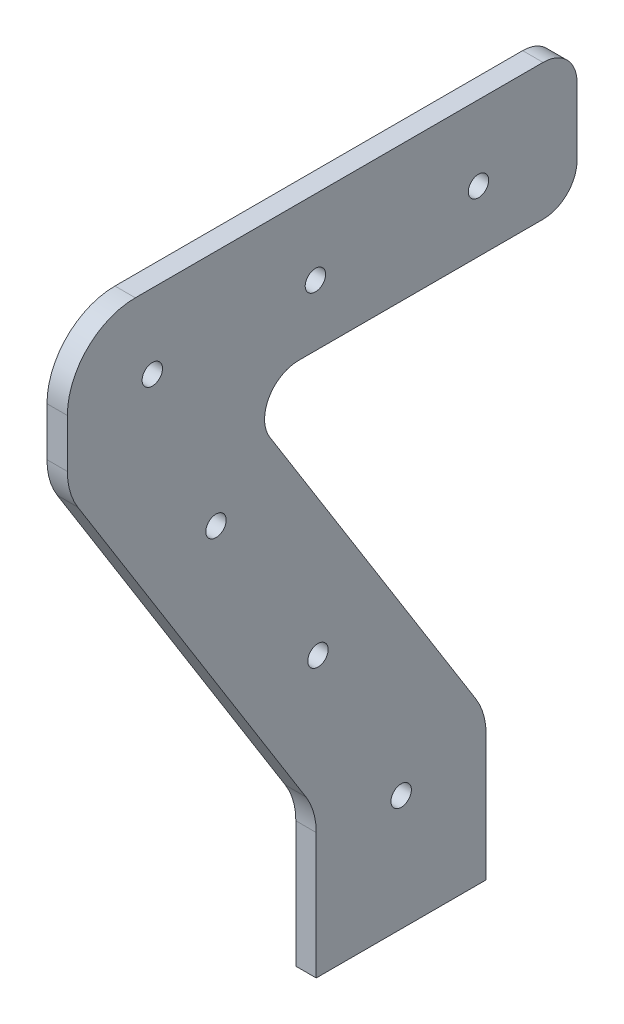
ISO-10303-21;
HEADER;
FILE_DESCRIPTION(('STEP AP214'),'2;1');
FILE_NAME('part.step','',(''),(''),'','','');
FILE_SCHEMA(('AUTOMOTIVE_DESIGN { 1 0 10303 214 1 1 1 1 }'));
ENDSEC;
DATA;
#1=APPLICATION_CONTEXT('core data for automotive mechanical design processes');
#2=APPLICATION_PROTOCOL_DEFINITION('international standard','automotive_design',2000,#1);
#3=PRODUCT_CONTEXT('',#1,'mechanical');
#4=PRODUCT('Part','Part','',(#3));
#5=PRODUCT_RELATED_PRODUCT_CATEGORY('part','',(#4));
#6=PRODUCT_DEFINITION_FORMATION('','',#4);
#7=PRODUCT_DEFINITION_CONTEXT('part definition',#1,'design');
#8=PRODUCT_DEFINITION('design','',#6,#7);
#9=PRODUCT_DEFINITION_SHAPE('','',#8);
#10=(LENGTH_UNIT() NAMED_UNIT(*) SI_UNIT(.MILLI.,.METRE.));
#11=(NAMED_UNIT(*) PLANE_ANGLE_UNIT() SI_UNIT($,.RADIAN.));
#12=(NAMED_UNIT(*) SI_UNIT($,.STERADIAN.) SOLID_ANGLE_UNIT());
#13=UNCERTAINTY_MEASURE_WITH_UNIT(LENGTH_MEASURE(1.E-05),#10,'distance_accuracy_value','');
#14=(GEOMETRIC_REPRESENTATION_CONTEXT(3) GLOBAL_UNCERTAINTY_ASSIGNED_CONTEXT((#13)) GLOBAL_UNIT_ASSIGNED_CONTEXT((#10,
#11,#12)) REPRESENTATION_CONTEXT('',''));
#15=CARTESIAN_POINT('',(0.,0.,0.));
#16=DIRECTION('',(0.,0.,1.));
#17=DIRECTION('',(1.,0.,0.));
#18=AXIS2_PLACEMENT_3D('',#15,#16,#17);
#19=CARTESIAN_POINT('',(3.,0.,0.));
#20=DIRECTION('',(0.,0.,-1.));
#21=DIRECTION('',(-1.,0.,0.));
#22=AXIS2_PLACEMENT_3D('',#19,#20,#21);
#23=PLANE('',#22);
#24=DIRECTION('',(0.,-1.,0.));
#25=VECTOR('',#24,1.);
#26=CARTESIAN_POINT('',(0.,0.,0.));
#27=LINE('',#26,#25);
#28=CARTESIAN_POINT('',(0.,-10.,0.));
#29=VERTEX_POINT('',#28);
#30=CARTESIAN_POINT('',(0.,-17.1320377358859,0.));
#31=VERTEX_POINT('',#30);
#32=EDGE_CURVE('E221',#29,#31,#27,.T.);
#33=ORIENTED_EDGE('',*,*,#32,.T.);
#34=DIRECTION('',(1.,0.,0.));
#35=VECTOR('',#34,1.);
#36=CARTESIAN_POINT('',(3.,-17.1320377358859,0.));
#37=LINE('',#36,#35);
#38=CARTESIAN_POINT('',(3.,-17.1320377358859,0.));
#39=VERTEX_POINT('',#38);
#40=EDGE_CURVE('E260',#31,#39,#37,.T.);
#41=ORIENTED_EDGE('',*,*,#40,.T.);
#42=DIRECTION('',(0.,-1.,0.));
#43=VECTOR('',#42,1.);
#44=CARTESIAN_POINT('',(3.,0.,0.));
#45=LINE('',#44,#43);
#46=CARTESIAN_POINT('',(3.,-10.,0.));
#47=VERTEX_POINT('',#46);
#48=EDGE_CURVE('E230',#47,#39,#45,.T.);
#49=ORIENTED_EDGE('',*,*,#48,.F.);
#50=DIRECTION('',(-1.,0.,0.));
#51=VECTOR('',#50,1.);
#52=CARTESIAN_POINT('',(3.,-10.,0.));
#53=LINE('',#52,#51);
#54=EDGE_CURVE('E257',#47,#29,#53,.T.);
#55=ORIENTED_EDGE('',*,*,#54,.T.);
#56=EDGE_LOOP('',(#33,#41,#49,#55));
#57=FACE_BOUND('',#56,.T.);
#58=ADVANCED_FACE('F77',(#57),#23,.F.);
#59=CARTESIAN_POINT('',(3.,-100.,0.));
#60=DIRECTION('',(0.,1.,0.));
#61=DIRECTION('',(0.,0.,1.));
#62=AXIS2_PLACEMENT_3D('',#59,#60,#61);
#63=PLANE('',#62);
#64=DIRECTION('',(1.,0.,0.));
#65=VECTOR('',#64,1.);
#66=CARTESIAN_POINT('',(0.,-100.,-61.6219787528252));
#67=LINE('',#66,#65);
#68=CARTESIAN_POINT('',(0.,-100.,-61.6219787528252));
#69=VERTEX_POINT('',#68);
#70=CARTESIAN_POINT('',(3.,-100.,-61.6219787528252));
#71=VERTEX_POINT('',#70);
#72=EDGE_CURVE('E190',#69,#71,#67,.T.);
#73=ORIENTED_EDGE('',*,*,#72,.T.);
#74=DIRECTION('',(0.,0.,-1.));
#75=VECTOR('',#74,1.);
#76=CARTESIAN_POINT('',(3.,-100.,0.));
#77=LINE('',#76,#75);
#78=CARTESIAN_POINT('',(3.,-100.,-36.6219787528252));
#79=VERTEX_POINT('',#78);
#80=EDGE_CURVE('E327',#79,#71,#77,.T.);
#81=ORIENTED_EDGE('',*,*,#80,.F.);
#82=DIRECTION('',(1.,0.,0.));
#83=VECTOR('',#82,1.);
#84=CARTESIAN_POINT('',(0.,-100.,-36.6219787528252));
#85=LINE('',#84,#83);
#86=CARTESIAN_POINT('',(0.,-100.,-36.6219787528252));
#87=VERTEX_POINT('',#86);
#88=EDGE_CURVE('E219',#87,#79,#85,.T.);
#89=ORIENTED_EDGE('',*,*,#88,.F.);
#90=DIRECTION('',(0.,0.,-1.));
#91=VECTOR('',#90,1.);
#92=CARTESIAN_POINT('',(0.,-100.,0.));
#93=LINE('',#92,#91);
#94=EDGE_CURVE('E210',#87,#69,#93,.T.);
#95=ORIENTED_EDGE('',*,*,#94,.T.);
#96=EDGE_LOOP('',(#73,#81,#89,#95));
#97=FACE_BOUND('',#96,.T.);
#98=ADVANCED_FACE('F217',(#97),#63,.F.);
#99=CARTESIAN_POINT('',(3.,0.,-75.));
#100=DIRECTION('',(0.,0.,1.));
#101=DIRECTION('',(0.,-1.,0.));
#102=AXIS2_PLACEMENT_3D('',#99,#100,#101);
#103=PLANE('',#102);
#104=DIRECTION('',(0.,1.,0.));
#105=VECTOR('',#104,1.);
#106=CARTESIAN_POINT('',(0.,0.,-75.));
#107=LINE('',#106,#105);
#108=CARTESIAN_POINT('',(0.,-15.,-75.));
#109=VERTEX_POINT('',#108);
#110=CARTESIAN_POINT('',(0.,-5.,-75.));
#111=VERTEX_POINT('',#110);
#112=EDGE_CURVE('E220',#109,#111,#107,.T.);
#113=ORIENTED_EDGE('',*,*,#112,.T.);
#114=DIRECTION('',(-1.,0.,0.));
#115=VECTOR('',#114,1.);
#116=CARTESIAN_POINT('',(3.,-5.,-75.));
#117=LINE('',#116,#115);
#118=CARTESIAN_POINT('',(3.,-5.,-75.));
#119=VERTEX_POINT('',#118);
#120=EDGE_CURVE('E92',#111,#119,#117,.F.);
#121=ORIENTED_EDGE('',*,*,#120,.T.);
#122=DIRECTION('',(0.,1.,0.));
#123=VECTOR('',#122,1.);
#124=CARTESIAN_POINT('',(3.,0.,-75.));
#125=LINE('',#124,#123);
#126=CARTESIAN_POINT('',(3.,-15.,-75.));
#127=VERTEX_POINT('',#126);
#128=EDGE_CURVE('E329',#127,#119,#125,.T.);
#129=ORIENTED_EDGE('',*,*,#128,.F.);
#130=DIRECTION('',(1.,0.,0.));
#131=VECTOR('',#130,1.);
#132=CARTESIAN_POINT('',(0.,-15.,-75.));
#133=LINE('',#132,#131);
#134=EDGE_CURVE('E285',#127,#109,#133,.F.);
#135=ORIENTED_EDGE('',*,*,#134,.T.);
#136=EDGE_LOOP('',(#113,#121,#129,#135));
#137=FACE_BOUND('',#136,.T.);
#138=ADVANCED_FACE('F375',(#137),#103,.F.);
#139=CARTESIAN_POINT('',(3.,0.,0.));
#140=DIRECTION('',(1.,0.,0.));
#141=DIRECTION('',(0.,0.,-1.));
#142=AXIS2_PLACEMENT_3D('',#139,#140,#141);
#143=PLANE('',#142);
#144=CARTESIAN_POINT('',(3.,-35.,-21.875));
#145=DIRECTION('',(1.,0.,0.));
#146=DIRECTION('',(0.,0.,-1.));
#147=AXIS2_PLACEMENT_3D('',#144,#145,#146);
#148=CIRCLE('',#147,1.5);
#149=CARTESIAN_POINT('',(3.,-35.,-23.375));
#150=VERTEX_POINT('',#149);
#151=EDGE_CURVE('E431',#150,#150,#148,.T.);
#152=ORIENTED_EDGE('',*,*,#151,.F.);
#153=EDGE_LOOP('',(#152));
#154=FACE_BOUND('',#153,.T.);
#155=CARTESIAN_POINT('',(3.,-11.,-36.5));
#156=DIRECTION('',(1.,0.,0.));
#157=DIRECTION('',(0.,0.,-1.));
#158=AXIS2_PLACEMENT_3D('',#155,#156,#157);
#159=CIRCLE('',#158,1.5);
#160=CARTESIAN_POINT('',(3.,-11.,-38.));
#161=VERTEX_POINT('',#160);
#162=EDGE_CURVE('E443',#161,#161,#159,.T.);
#163=ORIENTED_EDGE('',*,*,#162,.F.);
#164=EDGE_LOOP('',(#163));
#165=FACE_BOUND('',#164,.T.);
#166=CARTESIAN_POINT('',(3.,-11.,-60.5));
#167=DIRECTION('',(1.,0.,0.));
#168=DIRECTION('',(0.,0.,-1.));
#169=AXIS2_PLACEMENT_3D('',#166,#167,#168);
#170=CIRCLE('',#169,1.5);
#171=CARTESIAN_POINT('',(3.,-11.,-62.));
#172=VERTEX_POINT('',#171);
#173=EDGE_CURVE('E442',#172,#172,#170,.T.);
#174=ORIENTED_EDGE('',*,*,#173,.F.);
#175=EDGE_LOOP('',(#174));
#176=FACE_BOUND('',#175,.T.);
#177=CARTESIAN_POINT('',(3.,-59.,-36.875));
#178=DIRECTION('',(1.,0.,0.));
#179=DIRECTION('',(0.,0.,-1.));
#180=AXIS2_PLACEMENT_3D('',#177,#178,#179);
#181=CIRCLE('',#180,1.5);
#182=CARTESIAN_POINT('',(3.,-59.,-38.375));
#183=VERTEX_POINT('',#182);
#184=EDGE_CURVE('E427',#183,#183,#181,.T.);
#185=ORIENTED_EDGE('',*,*,#184,.F.);
#186=EDGE_LOOP('',(#185));
#187=FACE_BOUND('',#186,.T.);
#188=CARTESIAN_POINT('',(3.,-83.,-49.1219787528252));
#189=DIRECTION('',(1.,0.,0.));
#190=DIRECTION('',(0.,0.,-1.));
#191=AXIS2_PLACEMENT_3D('',#188,#189,#190);
#192=CIRCLE('',#191,1.5);
#193=CARTESIAN_POINT('',(3.,-83.,-50.6219787528252));
#194=VERTEX_POINT('',#193);
#195=EDGE_CURVE('E434',#194,#194,#192,.T.);
#196=ORIENTED_EDGE('',*,*,#195,.F.);
#197=EDGE_LOOP('',(#196));
#198=FACE_BOUND('',#197,.T.);
#199=CARTESIAN_POINT('',(3.,-11.,-12.5));
#200=DIRECTION('',(1.,0.,0.));
#201=DIRECTION('',(0.,0.,-1.));
#202=AXIS2_PLACEMENT_3D('',#199,#200,#201);
#203=CIRCLE('',#202,1.5);
#204=CARTESIAN_POINT('',(3.,-11.,-14.));
#205=VERTEX_POINT('',#204);
#206=EDGE_CURVE('E454',#205,#205,#203,.T.);
#207=ORIENTED_EDGE('',*,*,#206,.F.);
#208=EDGE_LOOP('',(#207));
#209=FACE_BOUND('',#208,.T.);
#210=ORIENTED_EDGE('',*,*,#128,.T.);
#211=CARTESIAN_POINT('',(3.,-5.,-70.));
#212=DIRECTION('',(1.,0.,0.));
#213=DIRECTION('',(0.,0.,-1.));
#214=AXIS2_PLACEMENT_3D('',#211,#212,#213);
#215=CIRCLE('',#214,5.);
#216=CARTESIAN_POINT('',(3.,0.,-70.));
#217=VERTEX_POINT('',#216);
#218=EDGE_CURVE('E289',#119,#217,#215,.T.);
#219=ORIENTED_EDGE('',*,*,#218,.T.);
#220=DIRECTION('',(0.,0.,1.));
#221=VECTOR('',#220,1.);
#222=CARTESIAN_POINT('',(3.,0.,0.));
#223=LINE('',#222,#221);
#224=CARTESIAN_POINT('',(3.,0.,-10.));
#225=VERTEX_POINT('',#224);
#226=EDGE_CURVE('E234',#217,#225,#223,.T.);
#227=ORIENTED_EDGE('',*,*,#226,.T.);
#228=CARTESIAN_POINT('',(3.,-10.,-10.));
#229=DIRECTION('',(1.,0.,0.));
#230=DIRECTION('',(0.,0.,-1.));
#231=AXIS2_PLACEMENT_3D('',#228,#229,#230);
#232=CIRCLE('',#231,10.);
#233=EDGE_CURVE('E233',#225,#47,#232,.T.);
#234=ORIENTED_EDGE('',*,*,#233,.T.);
#235=ORIENTED_EDGE('',*,*,#48,.T.);
#236=CARTESIAN_POINT('',(3.,-17.1320377358859,-10.));
#237=DIRECTION('',(1.,0.,0.));
#238=DIRECTION('',(0.,0.,-1.));
#239=AXIS2_PLACEMENT_3D('',#236,#237,#238);
#240=CIRCLE('',#239,10.);
#241=CARTESIAN_POINT('',(3.,-22.4320271359176,-1.52001695994908));
#242=VERTEX_POINT('',#241);
#243=EDGE_CURVE('E236',#39,#242,#240,.T.);
#244=ORIENTED_EDGE('',*,*,#243,.T.);
#245=DIRECTION('',(0.,-0.847998304005092,-0.529998940003174));
#246=VECTOR('',#245,1.);
#247=CARTESIAN_POINT('',(3.,-5.61797752808948,8.98876404494332));
#248=LINE('',#247,#246);
#249=CARTESIAN_POINT('',(3.,-76.1631388686017,-35.1019617928761));
#250=VERTEX_POINT('',#249);
#251=EDGE_CURVE('E202',#242,#250,#248,.T.);
#252=ORIENTED_EDGE('',*,*,#251,.T.);
#253=CARTESIAN_POINT('',(3.,-81.4631282686334,-26.6219787528251));
#254=DIRECTION('',(1.,0.,0.));
#255=DIRECTION('',(0.,0.,-1.));
#256=AXIS2_PLACEMENT_3D('',#253,#254,#255);
#257=CIRCLE('',#256,10.);
#258=CARTESIAN_POINT('',(3.,-81.4631282686334,-36.6219787528252));
#259=VERTEX_POINT('',#258);
#260=EDGE_CURVE('E266',#250,#259,#257,.F.);
#261=ORIENTED_EDGE('',*,*,#260,.T.);
#262=DIRECTION('',(0.,-1.,0.));
#263=VECTOR('',#262,1.);
#264=CARTESIAN_POINT('',(3.,0.,-36.6219787528252));
#265=LINE('',#264,#263);
#266=EDGE_CURVE('E319',#259,#79,#265,.T.);
#267=ORIENTED_EDGE('',*,*,#266,.T.);
#268=ORIENTED_EDGE('',*,*,#80,.T.);
#269=DIRECTION('',(0.,1.,0.));
#270=VECTOR('',#269,1.);
#271=CARTESIAN_POINT('',(3.,0.,-61.6219787528252));
#272=LINE('',#271,#270);
#273=CARTESIAN_POINT('',(3.,-81.4631282686334,-61.6219787528252));
#274=VERTEX_POINT('',#273);
#275=EDGE_CURVE('E197',#71,#274,#272,.T.);
#276=ORIENTED_EDGE('',*,*,#275,.T.);
#277=CARTESIAN_POINT('',(3.,-81.4631282686334,-51.6219787528252));
#278=DIRECTION('',(1.,0.,0.));
#279=DIRECTION('',(0.,0.,-1.));
#280=AXIS2_PLACEMENT_3D('',#277,#278,#279);
#281=CIRCLE('',#280,10.);
#282=CARTESIAN_POINT('',(3.,-76.1631388686016,-60.101961792876));
#283=VERTEX_POINT('',#282);
#284=EDGE_CURVE('E238',#274,#283,#281,.T.);
#285=ORIENTED_EDGE('',*,*,#284,.T.);
#286=DIRECTION('',(0.,-0.847998304005088,-0.52999894000318));
#287=VECTOR('',#286,1.);
#288=CARTESIAN_POINT('',(3.,5.61797752808988,-8.98876404494381));
#289=LINE('',#288,#287);
#290=CARTESIAN_POINT('',(3.,-27.6499947000159,-29.7812466875099));
#291=VERTEX_POINT('',#290);
#292=EDGE_CURVE('E214',#291,#283,#289,.T.);
#293=ORIENTED_EDGE('',*,*,#292,.F.);
#294=CARTESIAN_POINT('',(3.,-25.,-34.0212382075354));
#295=DIRECTION('',(1.,0.,0.));
#296=DIRECTION('',(0.,0.,-1.));
#297=AXIS2_PLACEMENT_3D('',#294,#295,#296);
#298=CIRCLE('',#297,5.);
#299=CARTESIAN_POINT('',(3.,-20.,-34.0212382075354));
#300=VERTEX_POINT('',#299);
#301=EDGE_CURVE('E85',#291,#300,#298,.F.);
#302=ORIENTED_EDGE('',*,*,#301,.T.);
#303=DIRECTION('',(0.,0.,-1.));
#304=VECTOR('',#303,1.);
#305=CARTESIAN_POINT('',(3.,-20.,0.));
#306=LINE('',#305,#304);
#307=CARTESIAN_POINT('',(3.,-20.,-70.));
#308=VERTEX_POINT('',#307);
#309=EDGE_CURVE('E293',#300,#308,#306,.T.);
#310=ORIENTED_EDGE('',*,*,#309,.T.);
#311=CARTESIAN_POINT('',(3.,-15.,-70.));
#312=DIRECTION('',(1.,0.,0.));
#313=DIRECTION('',(0.,0.,-1.));
#314=AXIS2_PLACEMENT_3D('',#311,#312,#313);
#315=CIRCLE('',#314,5.);
#316=EDGE_CURVE('E99',#308,#127,#315,.T.);
#317=ORIENTED_EDGE('',*,*,#316,.T.);
#318=EDGE_LOOP('',(#210,#219,#227,#234,#235,#244,#252,#261,#267,#268,#276,#285,#293,#302,#310,#317));
#319=FACE_BOUND('',#318,.T.);
#320=ADVANCED_FACE('F292',(#154,#165,#176,#187,#198,#209,#319),#143,.T.);
#321=CARTESIAN_POINT('',(0.,0.,0.));
#322=DIRECTION('',(1.,0.,0.));
#323=DIRECTION('',(0.,0.,-1.));
#324=AXIS2_PLACEMENT_3D('',#321,#322,#323);
#325=PLANE('',#324);
#326=CARTESIAN_POINT('',(0.,-35.,-21.875));
#327=DIRECTION('',(1.,0.,0.));
#328=DIRECTION('',(0.,0.,-1.));
#329=AXIS2_PLACEMENT_3D('',#326,#327,#328);
#330=CIRCLE('',#329,1.5);
#331=CARTESIAN_POINT('',(0.,-35.,-23.375));
#332=VERTEX_POINT('',#331);
#333=EDGE_CURVE('E446',#332,#332,#330,.T.);
#334=ORIENTED_EDGE('',*,*,#333,.T.);
#335=EDGE_LOOP('',(#334));
#336=FACE_BOUND('',#335,.T.);
#337=CARTESIAN_POINT('',(0.,-11.,-36.5));
#338=DIRECTION('',(1.,0.,0.));
#339=DIRECTION('',(0.,0.,-1.));
#340=AXIS2_PLACEMENT_3D('',#337,#338,#339);
#341=CIRCLE('',#340,1.5);
#342=CARTESIAN_POINT('',(0.,-11.,-38.));
#343=VERTEX_POINT('',#342);
#344=EDGE_CURVE('E439',#343,#343,#341,.T.);
#345=ORIENTED_EDGE('',*,*,#344,.T.);
#346=EDGE_LOOP('',(#345));
#347=FACE_BOUND('',#346,.T.);
#348=CARTESIAN_POINT('',(0.,-11.,-60.5));
#349=DIRECTION('',(1.,0.,0.));
#350=DIRECTION('',(0.,0.,-1.));
#351=AXIS2_PLACEMENT_3D('',#348,#349,#350);
#352=CIRCLE('',#351,1.5);
#353=CARTESIAN_POINT('',(0.,-11.,-62.));
#354=VERTEX_POINT('',#353);
#355=EDGE_CURVE('E451',#354,#354,#352,.T.);
#356=ORIENTED_EDGE('',*,*,#355,.T.);
#357=EDGE_LOOP('',(#356));
#358=FACE_BOUND('',#357,.T.);
#359=CARTESIAN_POINT('',(0.,-59.,-36.875));
#360=DIRECTION('',(1.,0.,0.));
#361=DIRECTION('',(0.,0.,-1.));
#362=AXIS2_PLACEMENT_3D('',#359,#360,#361);
#363=CIRCLE('',#362,1.5);
#364=CARTESIAN_POINT('',(0.,-59.,-38.375));
#365=VERTEX_POINT('',#364);
#366=EDGE_CURVE('E424',#365,#365,#363,.T.);
#367=ORIENTED_EDGE('',*,*,#366,.T.);
#368=EDGE_LOOP('',(#367));
#369=FACE_BOUND('',#368,.T.);
#370=CARTESIAN_POINT('',(0.,-83.,-49.1219787528252));
#371=DIRECTION('',(1.,0.,0.));
#372=DIRECTION('',(0.,0.,-1.));
#373=AXIS2_PLACEMENT_3D('',#370,#371,#372);
#374=CIRCLE('',#373,1.5);
#375=CARTESIAN_POINT('',(0.,-83.,-50.6219787528252));
#376=VERTEX_POINT('',#375);
#377=EDGE_CURVE('E429',#376,#376,#374,.T.);
#378=ORIENTED_EDGE('',*,*,#377,.T.);
#379=EDGE_LOOP('',(#378));
#380=FACE_BOUND('',#379,.T.);
#381=CARTESIAN_POINT('',(0.,-11.,-12.5));
#382=DIRECTION('',(1.,0.,0.));
#383=DIRECTION('',(0.,0.,-1.));
#384=AXIS2_PLACEMENT_3D('',#381,#382,#383);
#385=CIRCLE('',#384,1.5);
#386=CARTESIAN_POINT('',(0.,-11.,-14.));
#387=VERTEX_POINT('',#386);
#388=EDGE_CURVE('E312',#387,#387,#385,.T.);
#389=ORIENTED_EDGE('',*,*,#388,.T.);
#390=EDGE_LOOP('',(#389));
#391=FACE_BOUND('',#390,.T.);
#392=DIRECTION('',(0.,0.,1.));
#393=VECTOR('',#392,1.);
#394=CARTESIAN_POINT('',(0.,0.,0.));
#395=LINE('',#394,#393);
#396=CARTESIAN_POINT('',(0.,0.,-70.));
#397=VERTEX_POINT('',#396);
#398=CARTESIAN_POINT('',(0.,0.,-10.));
#399=VERTEX_POINT('',#398);
#400=EDGE_CURVE('E223',#397,#399,#395,.T.);
#401=ORIENTED_EDGE('',*,*,#400,.F.);
#402=CARTESIAN_POINT('',(0.,-5.,-70.));
#403=DIRECTION('',(1.,0.,0.));
#404=DIRECTION('',(0.,0.,-1.));
#405=AXIS2_PLACEMENT_3D('',#402,#403,#404);
#406=CIRCLE('',#405,5.);
#407=EDGE_CURVE('E283',#397,#111,#406,.F.);
#408=ORIENTED_EDGE('',*,*,#407,.T.);
#409=ORIENTED_EDGE('',*,*,#112,.F.);
#410=CARTESIAN_POINT('',(0.,-15.,-70.));
#411=DIRECTION('',(1.,0.,0.));
#412=DIRECTION('',(0.,0.,-1.));
#413=AXIS2_PLACEMENT_3D('',#410,#411,#412);
#414=CIRCLE('',#413,5.);
#415=CARTESIAN_POINT('',(0.,-20.,-70.));
#416=VERTEX_POINT('',#415);
#417=EDGE_CURVE('E281',#109,#416,#414,.F.);
#418=ORIENTED_EDGE('',*,*,#417,.T.);
#419=DIRECTION('',(0.,0.,-1.));
#420=VECTOR('',#419,1.);
#421=CARTESIAN_POINT('',(0.,-20.,0.));
#422=LINE('',#421,#420);
#423=CARTESIAN_POINT('',(0.,-20.,-34.0212382075354));
#424=VERTEX_POINT('',#423);
#425=EDGE_CURVE('E213',#424,#416,#422,.T.);
#426=ORIENTED_EDGE('',*,*,#425,.F.);
#427=CARTESIAN_POINT('',(0.,-25.,-34.0212382075354));
#428=DIRECTION('',(1.,0.,0.));
#429=DIRECTION('',(0.,0.,-1.));
#430=AXIS2_PLACEMENT_3D('',#427,#428,#429);
#431=CIRCLE('',#430,5.);
#432=CARTESIAN_POINT('',(0.,-27.6499947000159,-29.7812466875099));
#433=VERTEX_POINT('',#432);
#434=EDGE_CURVE('E12',#424,#433,#431,.T.);
#435=ORIENTED_EDGE('',*,*,#434,.T.);
#436=DIRECTION('',(0.,-0.847998304005088,-0.52999894000318));
#437=VECTOR('',#436,1.);
#438=CARTESIAN_POINT('',(0.,5.61797752808988,-8.98876404494381));
#439=LINE('',#438,#437);
#440=CARTESIAN_POINT('',(0.,-76.1631388686016,-60.101961792876));
#441=VERTEX_POINT('',#440);
#442=EDGE_CURVE('E203',#433,#441,#439,.T.);
#443=ORIENTED_EDGE('',*,*,#442,.T.);
#444=CARTESIAN_POINT('',(0.,-81.4631282686334,-51.6219787528252));
#445=DIRECTION('',(1.,0.,0.));
#446=DIRECTION('',(0.,0.,-1.));
#447=AXIS2_PLACEMENT_3D('',#444,#445,#446);
#448=CIRCLE('',#447,10.);
#449=CARTESIAN_POINT('',(0.,-81.4631282686334,-61.6219787528252));
#450=VERTEX_POINT('',#449);
#451=EDGE_CURVE('E212',#441,#450,#448,.F.);
#452=ORIENTED_EDGE('',*,*,#451,.T.);
#453=DIRECTION('',(0.,1.,0.));
#454=VECTOR('',#453,1.);
#455=CARTESIAN_POINT('',(0.,0.,-61.6219787528252));
#456=LINE('',#455,#454);
#457=EDGE_CURVE('E194',#69,#450,#456,.T.);
#458=ORIENTED_EDGE('',*,*,#457,.F.);
#459=ORIENTED_EDGE('',*,*,#94,.F.);
#460=DIRECTION('',(0.,-1.,0.));
#461=VECTOR('',#460,1.);
#462=CARTESIAN_POINT('',(0.,0.,-36.6219787528252));
#463=LINE('',#462,#461);
#464=CARTESIAN_POINT('',(0.,-81.4631282686334,-36.6219787528252));
#465=VERTEX_POINT('',#464);
#466=EDGE_CURVE('E318',#465,#87,#463,.T.);
#467=ORIENTED_EDGE('',*,*,#466,.F.);
#468=CARTESIAN_POINT('',(0.,-81.4631282686334,-26.6219787528251));
#469=DIRECTION('',(1.,0.,0.));
#470=DIRECTION('',(0.,0.,-1.));
#471=AXIS2_PLACEMENT_3D('',#468,#469,#470);
#472=CIRCLE('',#471,10.);
#473=CARTESIAN_POINT('',(0.,-76.1631388686017,-35.1019617928761));
#474=VERTEX_POINT('',#473);
#475=EDGE_CURVE('E268',#465,#474,#472,.T.);
#476=ORIENTED_EDGE('',*,*,#475,.T.);
#477=DIRECTION('',(0.,-0.847998304005092,-0.529998940003174));
#478=VECTOR('',#477,1.);
#479=CARTESIAN_POINT('',(0.,-5.61797752808948,8.98876404494332));
#480=LINE('',#479,#478);
#481=CARTESIAN_POINT('',(0.,-22.4320271359176,-1.52001695994908));
#482=VERTEX_POINT('',#481);
#483=EDGE_CURVE('E315',#482,#474,#480,.T.);
#484=ORIENTED_EDGE('',*,*,#483,.F.);
#485=CARTESIAN_POINT('',(0.,-17.1320377358859,-10.));
#486=DIRECTION('',(1.,0.,0.));
#487=DIRECTION('',(0.,0.,-1.));
#488=AXIS2_PLACEMENT_3D('',#485,#486,#487);
#489=CIRCLE('',#488,10.);
#490=EDGE_CURVE('E247',#482,#31,#489,.F.);
#491=ORIENTED_EDGE('',*,*,#490,.T.);
#492=ORIENTED_EDGE('',*,*,#32,.F.);
#493=CARTESIAN_POINT('',(0.,-10.,-10.));
#494=DIRECTION('',(1.,0.,0.));
#495=DIRECTION('',(0.,0.,-1.));
#496=AXIS2_PLACEMENT_3D('',#493,#494,#495);
#497=CIRCLE('',#496,10.);
#498=EDGE_CURVE('E244',#29,#399,#497,.F.);
#499=ORIENTED_EDGE('',*,*,#498,.T.);
#500=EDGE_LOOP('',(#401,#408,#409,#418,#426,#435,#443,#452,#458,#459,#467,#476,#484,#491,#492,#499));
#501=FACE_BOUND('',#500,.T.);
#502=ADVANCED_FACE('F208',(#336,#347,#358,#369,#380,#391,#501),#325,.F.);
#503=CARTESIAN_POINT('',(3.,0.,0.));
#504=DIRECTION('',(0.,-1.,0.));
#505=DIRECTION('',(0.,0.,-1.));
#506=AXIS2_PLACEMENT_3D('',#503,#504,#505);
#507=PLANE('',#506);
#508=ORIENTED_EDGE('',*,*,#226,.F.);
#509=DIRECTION('',(-1.,0.,0.));
#510=VECTOR('',#509,1.);
#511=CARTESIAN_POINT('',(3.,0.,-70.));
#512=LINE('',#511,#510);
#513=EDGE_CURVE('E278',#217,#397,#512,.T.);
#514=ORIENTED_EDGE('',*,*,#513,.T.);
#515=ORIENTED_EDGE('',*,*,#400,.T.);
#516=DIRECTION('',(-1.,0.,0.));
#517=VECTOR('',#516,1.);
#518=CARTESIAN_POINT('',(3.,0.,-10.));
#519=LINE('',#518,#517);
#520=EDGE_CURVE('E263',#399,#225,#519,.F.);
#521=ORIENTED_EDGE('',*,*,#520,.T.);
#522=EDGE_LOOP('',(#508,#514,#515,#521));
#523=FACE_BOUND('',#522,.T.);
#524=ADVANCED_FACE('F337',(#523),#507,.F.);
#525=CARTESIAN_POINT('',(0.,-5.61797752808948,8.98876404494332));
#526=DIRECTION('',(0.,-0.529998940003174,0.847998304005092));
#527=DIRECTION('',(0.,-0.847998304005092,-0.529998940003174));
#528=AXIS2_PLACEMENT_3D('',#525,#526,#527);
#529=PLANE('',#528);
#530=ORIENTED_EDGE('',*,*,#483,.T.);
#531=DIRECTION('',(1.,0.,0.));
#532=VECTOR('',#531,1.);
#533=CARTESIAN_POINT('',(3.,-76.1631388686017,-35.1019617928761));
#534=LINE('',#533,#532);
#535=EDGE_CURVE('E252',#474,#250,#534,.T.);
#536=ORIENTED_EDGE('',*,*,#535,.T.);
#537=ORIENTED_EDGE('',*,*,#251,.F.);
#538=DIRECTION('',(1.,0.,0.));
#539=VECTOR('',#538,1.);
#540=CARTESIAN_POINT('',(0.,-22.4320271359176,-1.52001695994908));
#541=LINE('',#540,#539);
#542=EDGE_CURVE('E250',#242,#482,#541,.F.);
#543=ORIENTED_EDGE('',*,*,#542,.T.);
#544=EDGE_LOOP('',(#530,#536,#537,#543));
#545=FACE_BOUND('',#544,.T.);
#546=ADVANCED_FACE('F351',(#545),#529,.T.);
#547=CARTESIAN_POINT('',(0.,0.,-36.6219787528252));
#548=DIRECTION('',(0.,0.,1.));
#549=DIRECTION('',(1.,0.,0.));
#550=AXIS2_PLACEMENT_3D('',#547,#548,#549);
#551=PLANE('',#550);
#552=ORIENTED_EDGE('',*,*,#266,.F.);
#553=DIRECTION('',(1.,0.,0.));
#554=VECTOR('',#553,1.);
#555=CARTESIAN_POINT('',(0.,-81.4631282686334,-36.6219787528252));
#556=LINE('',#555,#554);
#557=EDGE_CURVE('E255',#259,#465,#556,.F.);
#558=ORIENTED_EDGE('',*,*,#557,.T.);
#559=ORIENTED_EDGE('',*,*,#466,.T.);
#560=ORIENTED_EDGE('',*,*,#88,.T.);
#561=EDGE_LOOP('',(#552,#558,#559,#560));
#562=FACE_BOUND('',#561,.T.);
#563=ADVANCED_FACE('F359',(#562),#551,.T.);
#564=CARTESIAN_POINT('',(0.,0.,-61.6219787528252));
#565=DIRECTION('',(0.,0.,-1.));
#566=DIRECTION('',(-1.,0.,0.));
#567=AXIS2_PLACEMENT_3D('',#564,#565,#566);
#568=PLANE('',#567);
#569=ORIENTED_EDGE('',*,*,#457,.T.);
#570=DIRECTION('',(1.,0.,0.));
#571=VECTOR('',#570,1.);
#572=CARTESIAN_POINT('',(3.,-81.4631282686334,-61.6219787528252));
#573=LINE('',#572,#571);
#574=EDGE_CURVE('E231',#450,#274,#573,.T.);
#575=ORIENTED_EDGE('',*,*,#574,.T.);
#576=ORIENTED_EDGE('',*,*,#275,.F.);
#577=ORIENTED_EDGE('',*,*,#72,.F.);
#578=EDGE_LOOP('',(#569,#575,#576,#577));
#579=FACE_BOUND('',#578,.T.);
#580=ADVANCED_FACE('F192',(#579),#568,.T.);
#581=CARTESIAN_POINT('',(0.,5.61797752808988,-8.98876404494381));
#582=DIRECTION('',(0.,-0.52999894000318,0.847998304005088));
#583=DIRECTION('',(0.,-0.847998304005088,-0.52999894000318));
#584=AXIS2_PLACEMENT_3D('',#581,#582,#583);
#585=PLANE('',#584);
#586=ORIENTED_EDGE('',*,*,#442,.F.);
#587=DIRECTION('',(1.,0.,0.));
#588=VECTOR('',#587,1.);
#589=CARTESIAN_POINT('',(0.,-27.6499947000159,-29.7812466875099));
#590=LINE('',#589,#588);
#591=EDGE_CURVE('E270',#433,#291,#590,.T.);
#592=ORIENTED_EDGE('',*,*,#591,.T.);
#593=ORIENTED_EDGE('',*,*,#292,.T.);
#594=DIRECTION('',(1.,0.,0.));
#595=VECTOR('',#594,1.);
#596=CARTESIAN_POINT('',(0.,-76.1631388686016,-60.101961792876));
#597=LINE('',#596,#595);
#598=EDGE_CURVE('E241',#283,#441,#597,.F.);
#599=ORIENTED_EDGE('',*,*,#598,.T.);
#600=EDGE_LOOP('',(#586,#592,#593,#599));
#601=FACE_BOUND('',#600,.T.);
#602=ADVANCED_FACE('F307',(#601),#585,.F.);
#603=CARTESIAN_POINT('',(0.,-20.,0.));
#604=DIRECTION('',(0.,-1.,0.));
#605=DIRECTION('',(0.,0.,-1.));
#606=AXIS2_PLACEMENT_3D('',#603,#604,#605);
#607=PLANE('',#606);
#608=ORIENTED_EDGE('',*,*,#309,.F.);
#609=DIRECTION('',(1.,0.,0.));
#610=VECTOR('',#609,1.);
#611=CARTESIAN_POINT('',(0.,-20.,-34.0212382075354));
#612=LINE('',#611,#610);
#613=EDGE_CURVE('E276',#300,#424,#612,.F.);
#614=ORIENTED_EDGE('',*,*,#613,.T.);
#615=ORIENTED_EDGE('',*,*,#425,.T.);
#616=DIRECTION('',(1.,0.,0.));
#617=VECTOR('',#616,1.);
#618=CARTESIAN_POINT('',(3.,-20.,-70.));
#619=LINE('',#618,#617);
#620=EDGE_CURVE('E273',#416,#308,#619,.T.);
#621=ORIENTED_EDGE('',*,*,#620,.T.);
#622=EDGE_LOOP('',(#608,#614,#615,#621));
#623=FACE_BOUND('',#622,.T.);
#624=ADVANCED_FACE('F298',(#623),#607,.T.);
#625=CARTESIAN_POINT('',(0.,-81.4631282686334,-51.6219787528252));
#626=DIRECTION('',(-1.,0.,0.));
#627=DIRECTION('',(0.,0.,1.));
#628=AXIS2_PLACEMENT_3D('',#625,#626,#627);
#629=CYLINDRICAL_SURFACE('',#628,10.);
#630=ORIENTED_EDGE('',*,*,#451,.F.);
#631=ORIENTED_EDGE('',*,*,#598,.F.);
#632=ORIENTED_EDGE('',*,*,#284,.F.);
#633=ORIENTED_EDGE('',*,*,#574,.F.);
#634=EDGE_LOOP('',(#630,#631,#632,#633));
#635=FACE_BOUND('',#634,.T.);
#636=ADVANCED_FACE('F361',(#635),#629,.T.);
#637=CARTESIAN_POINT('',(0.,-81.4631282686334,-26.6219787528251));
#638=DIRECTION('',(-1.,0.,0.));
#639=DIRECTION('',(0.,0.,1.));
#640=AXIS2_PLACEMENT_3D('',#637,#638,#639);
#641=CYLINDRICAL_SURFACE('',#640,10.);
#642=ORIENTED_EDGE('',*,*,#475,.F.);
#643=ORIENTED_EDGE('',*,*,#557,.F.);
#644=ORIENTED_EDGE('',*,*,#260,.F.);
#645=ORIENTED_EDGE('',*,*,#535,.F.);
#646=EDGE_LOOP('',(#642,#643,#644,#645));
#647=FACE_BOUND('',#646,.T.);
#648=ADVANCED_FACE('F355',(#647),#641,.F.);
#649=CARTESIAN_POINT('',(3.,-17.1320377358859,-10.));
#650=DIRECTION('',(-1.,0.,0.));
#651=DIRECTION('',(0.,0.,1.));
#652=AXIS2_PLACEMENT_3D('',#649,#650,#651);
#653=CYLINDRICAL_SURFACE('',#652,10.);
#654=ORIENTED_EDGE('',*,*,#490,.F.);
#655=ORIENTED_EDGE('',*,*,#542,.F.);
#656=ORIENTED_EDGE('',*,*,#243,.F.);
#657=ORIENTED_EDGE('',*,*,#40,.F.);
#658=EDGE_LOOP('',(#654,#655,#656,#657));
#659=FACE_BOUND('',#658,.T.);
#660=ADVANCED_FACE('F348',(#659),#653,.T.);
#661=CARTESIAN_POINT('',(3.,-10.,-10.));
#662=DIRECTION('',(-1.,0.,0.));
#663=DIRECTION('',(0.,0.,1.));
#664=AXIS2_PLACEMENT_3D('',#661,#662,#663);
#665=CYLINDRICAL_SURFACE('',#664,10.);
#666=ORIENTED_EDGE('',*,*,#233,.F.);
#667=ORIENTED_EDGE('',*,*,#520,.F.);
#668=ORIENTED_EDGE('',*,*,#498,.F.);
#669=ORIENTED_EDGE('',*,*,#54,.F.);
#670=EDGE_LOOP('',(#666,#667,#668,#669));
#671=FACE_BOUND('',#670,.T.);
#672=ADVANCED_FACE('F340',(#671),#665,.T.);
#673=CARTESIAN_POINT('',(0.,-25.,-34.0212382075354));
#674=DIRECTION('',(1.,0.,0.));
#675=DIRECTION('',(0.,0.,-1.));
#676=AXIS2_PLACEMENT_3D('',#673,#674,#675);
#677=CYLINDRICAL_SURFACE('',#676,5.);
#678=ORIENTED_EDGE('',*,*,#434,.F.);
#679=ORIENTED_EDGE('',*,*,#613,.F.);
#680=ORIENTED_EDGE('',*,*,#301,.F.);
#681=ORIENTED_EDGE('',*,*,#591,.F.);
#682=EDGE_LOOP('',(#678,#679,#680,#681));
#683=FACE_BOUND('',#682,.T.);
#684=ADVANCED_FACE('F304',(#683),#677,.F.);
#685=CARTESIAN_POINT('',(3.,-5.,-70.));
#686=DIRECTION('',(-1.,0.,0.));
#687=DIRECTION('',(0.,0.,1.));
#688=AXIS2_PLACEMENT_3D('',#685,#686,#687);
#689=CYLINDRICAL_SURFACE('',#688,5.);
#690=ORIENTED_EDGE('',*,*,#218,.F.);
#691=ORIENTED_EDGE('',*,*,#120,.F.);
#692=ORIENTED_EDGE('',*,*,#407,.F.);
#693=ORIENTED_EDGE('',*,*,#513,.F.);
#694=EDGE_LOOP('',(#690,#691,#692,#693));
#695=FACE_BOUND('',#694,.T.);
#696=ADVANCED_FACE('F524',(#695),#689,.T.);
#697=CARTESIAN_POINT('',(0.,-15.,-70.));
#698=DIRECTION('',(-1.,0.,0.));
#699=DIRECTION('',(0.,0.,1.));
#700=AXIS2_PLACEMENT_3D('',#697,#698,#699);
#701=CYLINDRICAL_SURFACE('',#700,5.);
#702=ORIENTED_EDGE('',*,*,#417,.F.);
#703=ORIENTED_EDGE('',*,*,#134,.F.);
#704=ORIENTED_EDGE('',*,*,#316,.F.);
#705=ORIENTED_EDGE('',*,*,#620,.F.);
#706=EDGE_LOOP('',(#702,#703,#704,#705));
#707=FACE_BOUND('',#706,.T.);
#708=ADVANCED_FACE('F79',(#707),#701,.T.);
#709=CARTESIAN_POINT('',(0.,-11.,-12.5));
#710=DIRECTION('',(1.,0.,0.));
#711=DIRECTION('',(0.,0.,-1.));
#712=AXIS2_PLACEMENT_3D('',#709,#710,#711);
#713=CYLINDRICAL_SURFACE('',#712,1.5);
#714=ORIENTED_EDGE('',*,*,#388,.F.);
#715=EDGE_LOOP('',(#714));
#716=FACE_BOUND('',#715,.T.);
#717=ORIENTED_EDGE('',*,*,#206,.T.);
#718=EDGE_LOOP('',(#717));
#719=FACE_BOUND('',#718,.T.);
#720=ADVANCED_FACE('F396',(#716,#719),#713,.F.);
#721=CARTESIAN_POINT('',(0.,-83.,-49.1219787528252));
#722=DIRECTION('',(1.,0.,0.));
#723=DIRECTION('',(0.,0.,-1.));
#724=AXIS2_PLACEMENT_3D('',#721,#722,#723);
#725=CYLINDRICAL_SURFACE('',#724,1.5);
#726=ORIENTED_EDGE('',*,*,#377,.F.);
#727=EDGE_LOOP('',(#726));
#728=FACE_BOUND('',#727,.T.);
#729=ORIENTED_EDGE('',*,*,#195,.T.);
#730=EDGE_LOOP('',(#729));
#731=FACE_BOUND('',#730,.T.);
#732=ADVANCED_FACE('F399',(#728,#731),#725,.F.);
#733=CARTESIAN_POINT('',(0.,-59.,-36.875));
#734=DIRECTION('',(1.,0.,0.));
#735=DIRECTION('',(0.,0.,-1.));
#736=AXIS2_PLACEMENT_3D('',#733,#734,#735);
#737=CYLINDRICAL_SURFACE('',#736,1.5);
#738=ORIENTED_EDGE('',*,*,#366,.F.);
#739=EDGE_LOOP('',(#738));
#740=FACE_BOUND('',#739,.T.);
#741=ORIENTED_EDGE('',*,*,#184,.T.);
#742=EDGE_LOOP('',(#741));
#743=FACE_BOUND('',#742,.T.);
#744=ADVANCED_FACE('F405',(#740,#743),#737,.F.);
#745=CARTESIAN_POINT('',(0.,-11.,-60.5));
#746=DIRECTION('',(1.,0.,0.));
#747=DIRECTION('',(0.,0.,-1.));
#748=AXIS2_PLACEMENT_3D('',#745,#746,#747);
#749=CYLINDRICAL_SURFACE('',#748,1.5);
#750=ORIENTED_EDGE('',*,*,#355,.F.);
#751=EDGE_LOOP('',(#750));
#752=FACE_BOUND('',#751,.T.);
#753=ORIENTED_EDGE('',*,*,#173,.T.);
#754=EDGE_LOOP('',(#753));
#755=FACE_BOUND('',#754,.T.);
#756=ADVANCED_FACE('F401',(#752,#755),#749,.F.);
#757=CARTESIAN_POINT('',(0.,-11.,-36.5));
#758=DIRECTION('',(1.,0.,0.));
#759=DIRECTION('',(0.,0.,-1.));
#760=AXIS2_PLACEMENT_3D('',#757,#758,#759);
#761=CYLINDRICAL_SURFACE('',#760,1.5);
#762=ORIENTED_EDGE('',*,*,#344,.F.);
#763=EDGE_LOOP('',(#762));
#764=FACE_BOUND('',#763,.T.);
#765=ORIENTED_EDGE('',*,*,#162,.T.);
#766=EDGE_LOOP('',(#765));
#767=FACE_BOUND('',#766,.T.);
#768=ADVANCED_FACE('F404',(#764,#767),#761,.F.);
#769=CARTESIAN_POINT('',(0.,-35.,-21.875));
#770=DIRECTION('',(1.,0.,0.));
#771=DIRECTION('',(0.,0.,-1.));
#772=AXIS2_PLACEMENT_3D('',#769,#770,#771);
#773=CYLINDRICAL_SURFACE('',#772,1.5);
#774=ORIENTED_EDGE('',*,*,#333,.F.);
#775=EDGE_LOOP('',(#774));
#776=FACE_BOUND('',#775,.T.);
#777=ORIENTED_EDGE('',*,*,#151,.T.);
#778=EDGE_LOOP('',(#777));
#779=FACE_BOUND('',#778,.T.);
#780=ADVANCED_FACE('F407',(#776,#779),#773,.F.);
#781=CLOSED_SHELL('',(#58,#98,#138,#320,#502,#524,#546,#563,#580,#602,#624,#636,#648,#660,#672,
#684,#696,#708,#720,#732,#744,#756,#768,#780));
#782=MANIFOLD_SOLID_BREP('B2',#781);
#783=ADVANCED_BREP_SHAPE_REPRESENTATION('',(#18,#782),#14);
#784=SHAPE_DEFINITION_REPRESENTATION(#9,#783);
ENDSEC;
END-ISO-10303-21;
